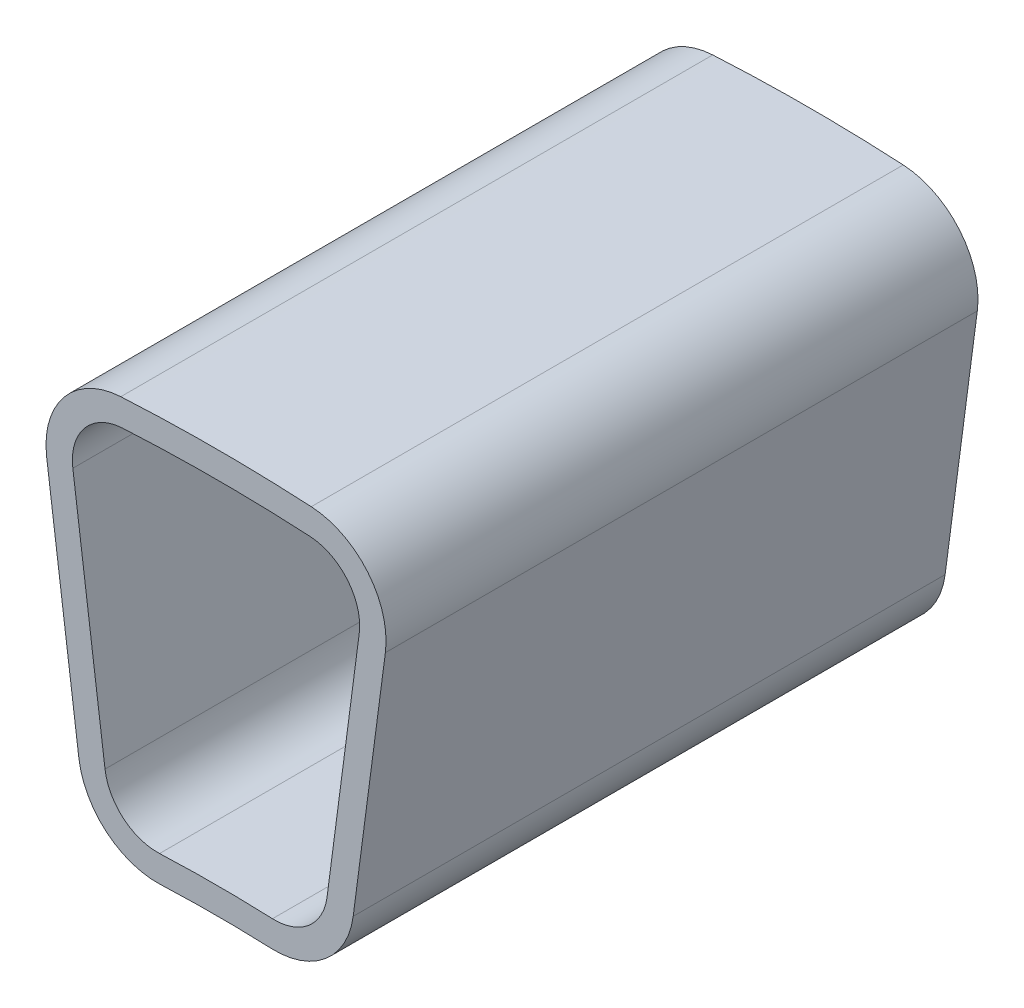
ISO-10303-21;
HEADER;
FILE_DESCRIPTION(('STEP AP214'),'2;1');
FILE_NAME('part.step','',(''),(''),'','','');
FILE_SCHEMA(('AUTOMOTIVE_DESIGN { 1 0 10303 214 1 1 1 1 }'));
ENDSEC;
DATA;
#1=APPLICATION_CONTEXT('core data for automotive mechanical design processes');
#2=APPLICATION_PROTOCOL_DEFINITION('international standard','automotive_design',2000,#1);
#3=PRODUCT_CONTEXT('',#1,'mechanical');
#4=PRODUCT('Part','Part','',(#3));
#5=PRODUCT_RELATED_PRODUCT_CATEGORY('part','',(#4));
#6=PRODUCT_DEFINITION_FORMATION('','',#4);
#7=PRODUCT_DEFINITION_CONTEXT('part definition',#1,'design');
#8=PRODUCT_DEFINITION('design','',#6,#7);
#9=PRODUCT_DEFINITION_SHAPE('','',#8);
#10=(LENGTH_UNIT() NAMED_UNIT(*) SI_UNIT(.MILLI.,.METRE.));
#11=(NAMED_UNIT(*) PLANE_ANGLE_UNIT() SI_UNIT($,.RADIAN.));
#12=(NAMED_UNIT(*) SI_UNIT($,.STERADIAN.) SOLID_ANGLE_UNIT());
#13=UNCERTAINTY_MEASURE_WITH_UNIT(LENGTH_MEASURE(1.E-05),#10,'distance_accuracy_value','');
#14=(GEOMETRIC_REPRESENTATION_CONTEXT(3) GLOBAL_UNCERTAINTY_ASSIGNED_CONTEXT((#13)) GLOBAL_UNIT_ASSIGNED_CONTEXT((#10,
#11,#12)) REPRESENTATION_CONTEXT('',''));
#15=CARTESIAN_POINT('',(0.,0.,0.));
#16=DIRECTION('',(0.,0.,1.));
#17=DIRECTION('',(1.,0.,0.));
#18=AXIS2_PLACEMENT_3D('',#15,#16,#17);
#19=CARTESIAN_POINT('',(0.,0.,63.7248048977731));
#20=DIRECTION('',(0.,0.,-1.));
#21=DIRECTION('',(-1.,0.,0.));
#22=AXIS2_PLACEMENT_3D('',#19,#20,#21);
#23=CYLINDRICAL_SURFACE('',#22,74.53735196805);
#24=CARTESIAN_POINT('',(0.,0.,33.65));
#25=DIRECTION('',(0.,0.,1.));
#26=DIRECTION('',(1.,0.,0.));
#27=AXIS2_PLACEMENT_3D('',#24,#25,#26);
#28=CIRCLE('',#27,74.53735196805);
#29=CARTESIAN_POINT('',(-3.14586682006046,74.4709363467347,33.65));
#30=VERTEX_POINT('',#29);
#31=CARTESIAN_POINT('',(3.14586682006045,74.4709363467347,33.65));
#32=VERTEX_POINT('',#31);
#33=EDGE_CURVE('E310',#30,#32,#28,.F.);
#34=ORIENTED_EDGE('',*,*,#33,.F.);
#35=DIRECTION('',(0.,0.,-1.));
#36=VECTOR('',#35,1.);
#37=CARTESIAN_POINT('',(-3.14586682006046,74.4709363467347,63.7248048977731));
#38=LINE('',#37,#36);
#39=CARTESIAN_POINT('',(-3.14586682006046,74.4709363467347,0.));
#40=VERTEX_POINT('',#39);
#41=EDGE_CURVE('E54',#30,#40,#38,.T.);
#42=ORIENTED_EDGE('',*,*,#41,.T.);
#43=CARTESIAN_POINT('',(0.,0.,0.));
#44=DIRECTION('',(0.,0.,-1.));
#45=DIRECTION('',(1.,0.,0.));
#46=AXIS2_PLACEMENT_3D('',#43,#44,#45);
#47=CIRCLE('',#46,74.53735196805);
#48=CARTESIAN_POINT('',(3.14586682006045,74.4709363467347,0.));
#49=VERTEX_POINT('',#48);
#50=EDGE_CURVE('E205',#40,#49,#47,.T.);
#51=ORIENTED_EDGE('',*,*,#50,.T.);
#52=DIRECTION('',(0.,0.,-1.));
#53=VECTOR('',#52,1.);
#54=CARTESIAN_POINT('',(3.14586682006045,74.4709363467347,63.7248048977731));
#55=LINE('',#54,#53);
#56=EDGE_CURVE('E208',#32,#49,#55,.T.);
#57=ORIENTED_EDGE('',*,*,#56,.F.);
#58=EDGE_LOOP('',(#34,#42,#51,#57));
#59=FACE_BOUND('',#58,.T.);
#60=ADVANCED_FACE('F39',(#59),#23,.F.);
#61=CARTESIAN_POINT('',(-3.33579039953427,78.9669266752341,63.7248048977731));
#62=DIRECTION('',(0.,0.,-1.));
#63=DIRECTION('',(-1.,0.,0.));
#64=AXIS2_PLACEMENT_3D('',#61,#62,#63);
#65=CYLINDRICAL_SURFACE('',#64,4.5);
#66=CARTESIAN_POINT('',(-3.33579039953427,78.9669266752341,33.65));
#67=DIRECTION('',(0.,0.,1.));
#68=DIRECTION('',(1.,0.,0.));
#69=AXIS2_PLACEMENT_3D('',#66,#67,#68);
#70=CIRCLE('',#69,4.5);
#71=CARTESIAN_POINT('',(-7.79729227571643,78.3795588102439,33.65));
#72=VERTEX_POINT('',#71);
#73=EDGE_CURVE('E246',#72,#30,#70,.T.);
#74=ORIENTED_EDGE('',*,*,#73,.F.);
#75=DIRECTION('',(0.,0.,-1.));
#76=VECTOR('',#75,1.);
#77=CARTESIAN_POINT('',(-7.79729227571643,78.3795588102439,63.7248048977731));
#78=LINE('',#77,#76);
#79=CARTESIAN_POINT('',(-7.79729227571643,78.3795588102439,0.));
#80=VERTEX_POINT('',#79);
#81=EDGE_CURVE('E211',#72,#80,#78,.T.);
#82=ORIENTED_EDGE('',*,*,#81,.T.);
#83=CARTESIAN_POINT('',(-3.33579039953427,78.9669266752341,0.));
#84=DIRECTION('',(0.,0.,1.));
#85=DIRECTION('',(1.,0.,0.));
#86=AXIS2_PLACEMENT_3D('',#83,#84,#85);
#87=CIRCLE('',#86,4.5);
#88=EDGE_CURVE('E203',#80,#40,#87,.T.);
#89=ORIENTED_EDGE('',*,*,#88,.T.);
#90=ORIENTED_EDGE('',*,*,#41,.F.);
#91=EDGE_LOOP('',(#74,#82,#89,#90));
#92=FACE_BOUND('',#91,.T.);
#93=ADVANCED_FACE('F243',(#92),#65,.T.);
#94=CARTESIAN_POINT('',(-9.62675062646801,92.2756746020247,63.7248048977731));
#95=DIRECTION('',(0.99144486137381,0.130526192220051,0.));
#96=DIRECTION('',(-0.130526192220051,0.991444861373811,0.));
#97=AXIS2_PLACEMENT_3D('',#94,#95,#96);
#98=PLANE('',#97);
#99=DIRECTION('',(0.130526192220051,-0.991444861373811,0.));
#100=VECTOR('',#99,1.);
#101=CARTESIAN_POINT('',(-9.62675062646801,92.2756746020247,33.65));
#102=LINE('',#101,#100);
#103=CARTESIAN_POINT('',(-9.62675062646801,92.2756746020247,33.65));
#104=VERTEX_POINT('',#103);
#105=EDGE_CURVE('E251',#104,#72,#102,.T.);
#106=ORIENTED_EDGE('',*,*,#105,.F.);
#107=DIRECTION('',(0.,0.,-1.));
#108=VECTOR('',#107,1.);
#109=CARTESIAN_POINT('',(-9.62675062646801,92.2756746020247,63.7248048977731));
#110=LINE('',#109,#108);
#111=CARTESIAN_POINT('',(-9.62675062646801,92.2756746020247,0.));
#112=VERTEX_POINT('',#111);
#113=EDGE_CURVE('E213',#104,#112,#110,.T.);
#114=ORIENTED_EDGE('',*,*,#113,.T.);
#115=DIRECTION('',(0.130526192220051,-0.991444861373811,0.));
#116=VECTOR('',#115,1.);
#117=CARTESIAN_POINT('',(-9.62675062646801,92.2756746020247,0.));
#118=LINE('',#117,#116);
#119=EDGE_CURVE('E200',#112,#80,#118,.T.);
#120=ORIENTED_EDGE('',*,*,#119,.T.);
#121=ORIENTED_EDGE('',*,*,#81,.F.);
#122=EDGE_LOOP('',(#106,#114,#120,#121));
#123=FACE_BOUND('',#122,.T.);
#124=ADVANCED_FACE('F249',(#123),#98,.F.);
#125=CARTESIAN_POINT('',(-5.16524875028588,92.8630424670149,63.7248048977731));
#126=DIRECTION('',(0.,0.,-1.));
#127=DIRECTION('',(-1.,0.,0.));
#128=AXIS2_PLACEMENT_3D('',#125,#126,#127);
#129=CYLINDRICAL_SURFACE('',#128,4.49999999999999);
#130=CARTESIAN_POINT('',(-5.16524875028588,92.8630424670149,33.65));
#131=DIRECTION('',(0.,0.,1.));
#132=DIRECTION('',(1.,0.,0.));
#133=AXIS2_PLACEMENT_3D('',#130,#131,#132);
#134=CIRCLE('',#133,4.49999999999999);
#135=CARTESIAN_POINT('',(-5.41516245174076,97.3560974568659,33.65));
#136=VERTEX_POINT('',#135);
#137=EDGE_CURVE('E314',#136,#104,#134,.T.);
#138=ORIENTED_EDGE('',*,*,#137,.F.);
#139=DIRECTION('',(0.,0.,-1.));
#140=VECTOR('',#139,1.);
#141=CARTESIAN_POINT('',(-5.41516245174076,97.3560974568659,63.7248048977731));
#142=LINE('',#141,#140);
#143=CARTESIAN_POINT('',(-5.41516245174076,97.3560974568659,0.));
#144=VERTEX_POINT('',#143);
#145=EDGE_CURVE('E215',#136,#144,#142,.T.);
#146=ORIENTED_EDGE('',*,*,#145,.T.);
#147=CARTESIAN_POINT('',(-5.16524875028588,92.8630424670149,0.));
#148=DIRECTION('',(0.,0.,1.));
#149=DIRECTION('',(1.,0.,0.));
#150=AXIS2_PLACEMENT_3D('',#147,#148,#149);
#151=CIRCLE('',#150,4.49999999999999);
#152=EDGE_CURVE('E197',#144,#112,#151,.T.);
#153=ORIENTED_EDGE('',*,*,#152,.T.);
#154=ORIENTED_EDGE('',*,*,#113,.F.);
#155=EDGE_LOOP('',(#138,#146,#153,#154));
#156=FACE_BOUND('',#155,.T.);
#157=ADVANCED_FACE('F254',(#156),#129,.T.);
#158=CARTESIAN_POINT('',(0.,0.,63.7248048977731));
#159=DIRECTION('',(0.,0.,-1.));
#160=DIRECTION('',(-1.,0.,0.));
#161=AXIS2_PLACEMENT_3D('',#158,#159,#160);
#162=CYLINDRICAL_SURFACE('',#161,97.5065828362861);
#163=CARTESIAN_POINT('',(0.,0.,33.65));
#164=DIRECTION('',(0.,0.,1.));
#165=DIRECTION('',(1.,0.,0.));
#166=AXIS2_PLACEMENT_3D('',#163,#164,#165);
#167=CIRCLE('',#166,97.5065828362861);
#168=CARTESIAN_POINT('',(5.41516245174078,97.3560974568659,33.65));
#169=VERTEX_POINT('',#168);
#170=EDGE_CURVE('E260',#169,#136,#167,.T.);
#171=ORIENTED_EDGE('',*,*,#170,.F.);
#172=DIRECTION('',(0.,0.,-1.));
#173=VECTOR('',#172,1.);
#174=CARTESIAN_POINT('',(5.41516245174078,97.3560974568659,63.7248048977731));
#175=LINE('',#174,#173);
#176=CARTESIAN_POINT('',(5.41516245174078,97.3560974568659,0.));
#177=VERTEX_POINT('',#176);
#178=EDGE_CURVE('E217',#169,#177,#175,.T.);
#179=ORIENTED_EDGE('',*,*,#178,.T.);
#180=CARTESIAN_POINT('',(0.,0.,0.));
#181=DIRECTION('',(0.,0.,1.));
#182=DIRECTION('',(1.,0.,0.));
#183=AXIS2_PLACEMENT_3D('',#180,#181,#182);
#184=CIRCLE('',#183,97.5065828362861);
#185=EDGE_CURVE('E194',#177,#144,#184,.T.);
#186=ORIENTED_EDGE('',*,*,#185,.T.);
#187=ORIENTED_EDGE('',*,*,#145,.F.);
#188=EDGE_LOOP('',(#171,#179,#186,#187));
#189=FACE_BOUND('',#188,.T.);
#190=ADVANCED_FACE('F257',(#189),#162,.T.);
#191=CARTESIAN_POINT('',(5.16524875028588,92.8630424670149,63.7248048977731));
#192=DIRECTION('',(0.,0.,-1.));
#193=DIRECTION('',(-1.,0.,0.));
#194=AXIS2_PLACEMENT_3D('',#191,#192,#193);
#195=CYLINDRICAL_SURFACE('',#194,4.50000000000001);
#196=CARTESIAN_POINT('',(5.16524875028588,92.8630424670149,33.65));
#197=DIRECTION('',(0.,0.,1.));
#198=DIRECTION('',(1.,0.,0.));
#199=AXIS2_PLACEMENT_3D('',#196,#197,#198);
#200=CIRCLE('',#199,4.50000000000001);
#201=CARTESIAN_POINT('',(9.62675062646804,92.2756746020247,33.65));
#202=VERTEX_POINT('',#201);
#203=EDGE_CURVE('E264',#202,#169,#200,.T.);
#204=ORIENTED_EDGE('',*,*,#203,.F.);
#205=DIRECTION('',(0.,0.,-1.));
#206=VECTOR('',#205,1.);
#207=CARTESIAN_POINT('',(9.62675062646804,92.2756746020247,63.7248048977731));
#208=LINE('',#207,#206);
#209=CARTESIAN_POINT('',(9.62675062646804,92.2756746020247,0.));
#210=VERTEX_POINT('',#209);
#211=EDGE_CURVE('E219',#202,#210,#208,.T.);
#212=ORIENTED_EDGE('',*,*,#211,.T.);
#213=CARTESIAN_POINT('',(5.16524875028588,92.8630424670149,0.));
#214=DIRECTION('',(0.,0.,1.));
#215=DIRECTION('',(1.,0.,0.));
#216=AXIS2_PLACEMENT_3D('',#213,#214,#215);
#217=CIRCLE('',#216,4.50000000000001);
#218=EDGE_CURVE('E191',#210,#177,#217,.T.);
#219=ORIENTED_EDGE('',*,*,#218,.T.);
#220=ORIENTED_EDGE('',*,*,#178,.F.);
#221=EDGE_LOOP('',(#204,#212,#219,#220));
#222=FACE_BOUND('',#221,.T.);
#223=ADVANCED_FACE('F263',(#222),#195,.T.);
#224=CARTESIAN_POINT('',(7.7972922757164,78.3795588102438,63.7248048977731));
#225=DIRECTION('',(-0.99144486137381,0.130526192220054,0.));
#226=DIRECTION('',(-0.130526192220054,-0.99144486137381,0.));
#227=AXIS2_PLACEMENT_3D('',#224,#225,#226);
#228=PLANE('',#227);
#229=DIRECTION('',(0.130526192220054,0.99144486137381,0.));
#230=VECTOR('',#229,1.);
#231=CARTESIAN_POINT('',(7.7972922757164,78.3795588102438,33.65));
#232=LINE('',#231,#230);
#233=CARTESIAN_POINT('',(7.7972922757164,78.3795588102438,33.65));
#234=VERTEX_POINT('',#233);
#235=EDGE_CURVE('E227',#234,#202,#232,.T.);
#236=ORIENTED_EDGE('',*,*,#235,.F.);
#237=DIRECTION('',(0.,0.,-1.));
#238=VECTOR('',#237,1.);
#239=CARTESIAN_POINT('',(7.7972922757164,78.3795588102438,63.7248048977731));
#240=LINE('',#239,#238);
#241=CARTESIAN_POINT('',(7.7972922757164,78.3795588102438,0.));
#242=VERTEX_POINT('',#241);
#243=EDGE_CURVE('E47',#234,#242,#240,.T.);
#244=ORIENTED_EDGE('',*,*,#243,.T.);
#245=DIRECTION('',(0.130526192220054,0.99144486137381,0.));
#246=VECTOR('',#245,1.);
#247=CARTESIAN_POINT('',(7.7972922757164,78.3795588102438,0.));
#248=LINE('',#247,#246);
#249=EDGE_CURVE('E188',#242,#210,#248,.T.);
#250=ORIENTED_EDGE('',*,*,#249,.T.);
#251=ORIENTED_EDGE('',*,*,#211,.F.);
#252=EDGE_LOOP('',(#236,#244,#250,#251));
#253=FACE_BOUND('',#252,.T.);
#254=ADVANCED_FACE('F223',(#253),#228,.F.);
#255=CARTESIAN_POINT('',(3.33579039953427,78.966926675234,63.7248048977731));
#256=DIRECTION('',(0.,0.,-1.));
#257=DIRECTION('',(-1.,0.,0.));
#258=AXIS2_PLACEMENT_3D('',#255,#256,#257);
#259=CYLINDRICAL_SURFACE('',#258,4.49999999999999);
#260=CARTESIAN_POINT('',(3.33579039953427,78.966926675234,33.65));
#261=DIRECTION('',(0.,0.,1.));
#262=DIRECTION('',(1.,0.,0.));
#263=AXIS2_PLACEMENT_3D('',#260,#261,#262);
#264=CIRCLE('',#263,4.49999999999999);
#265=EDGE_CURVE('E237',#32,#234,#264,.T.);
#266=ORIENTED_EDGE('',*,*,#265,.F.);
#267=ORIENTED_EDGE('',*,*,#56,.T.);
#268=CARTESIAN_POINT('',(3.33579039953427,78.966926675234,0.));
#269=DIRECTION('',(0.,0.,1.));
#270=DIRECTION('',(1.,0.,0.));
#271=AXIS2_PLACEMENT_3D('',#268,#269,#270);
#272=CIRCLE('',#271,4.49999999999999);
#273=EDGE_CURVE('E185',#49,#242,#272,.T.);
#274=ORIENTED_EDGE('',*,*,#273,.T.);
#275=ORIENTED_EDGE('',*,*,#243,.F.);
#276=EDGE_LOOP('',(#266,#267,#274,#275));
#277=FACE_BOUND('',#276,.T.);
#278=ADVANCED_FACE('F41',(#277),#259,.T.);
#279=CARTESIAN_POINT('',(3.33579039953427,78.966926675234,0.));
#280=DIRECTION('',(0.,0.,1.));
#281=DIRECTION('',(1.,0.,0.));
#282=AXIS2_PLACEMENT_3D('',#279,#280,#281);
#283=PLANE('',#282);
#284=ORIENTED_EDGE('',*,*,#273,.F.);
#285=ORIENTED_EDGE('',*,*,#50,.F.);
#286=ORIENTED_EDGE('',*,*,#88,.F.);
#287=ORIENTED_EDGE('',*,*,#119,.F.);
#288=ORIENTED_EDGE('',*,*,#152,.F.);
#289=ORIENTED_EDGE('',*,*,#185,.F.);
#290=ORIENTED_EDGE('',*,*,#218,.F.);
#291=ORIENTED_EDGE('',*,*,#249,.F.);
#292=EDGE_LOOP('',(#284,#285,#286,#287,#288,#289,#290,#291));
#293=FACE_BOUND('',#292,.T.);
#294=CARTESIAN_POINT('',(5.16524875028588,92.8630424670149,0.));
#295=DIRECTION('',(0.,0.,1.));
#296=DIRECTION('',(1.,0.,0.));
#297=AXIS2_PLACEMENT_3D('',#294,#295,#296);
#298=CIRCLE('',#297,3.00000000000001);
#299=CARTESIAN_POINT('',(8.13958333440732,92.4714638903548,0.));
#300=VERTEX_POINT('',#299);
#301=CARTESIAN_POINT('',(5.33185788458914,95.8584124602489,0.));
#302=VERTEX_POINT('',#301);
#303=EDGE_CURVE('E266',#300,#302,#298,.T.);
#304=ORIENTED_EDGE('',*,*,#303,.T.);
#305=CARTESIAN_POINT('',(0.,0.,0.));
#306=DIRECTION('',(0.,0.,1.));
#307=DIRECTION('',(1.,0.,0.));
#308=AXIS2_PLACEMENT_3D('',#305,#306,#307);
#309=CIRCLE('',#308,96.0065828362861);
#310=CARTESIAN_POINT('',(-5.33185788458913,95.8584124602489,0.));
#311=VERTEX_POINT('',#310);
#312=EDGE_CURVE('E273',#302,#311,#309,.T.);
#313=ORIENTED_EDGE('',*,*,#312,.T.);
#314=CARTESIAN_POINT('',(-5.16524875028588,92.8630424670149,0.));
#315=DIRECTION('',(0.,0.,1.));
#316=DIRECTION('',(1.,0.,0.));
#317=AXIS2_PLACEMENT_3D('',#314,#315,#316);
#318=CIRCLE('',#317,2.99999999999998);
#319=CARTESIAN_POINT('',(-8.1395833344073,92.4714638903548,0.));
#320=VERTEX_POINT('',#319);
#321=EDGE_CURVE('E276',#311,#320,#318,.T.);
#322=ORIENTED_EDGE('',*,*,#321,.T.);
#323=DIRECTION('',(0.130526192220051,-0.991444861373811,0.));
#324=VECTOR('',#323,1.);
#325=CARTESIAN_POINT('',(-8.1395833344073,92.4714638903548,0.));
#326=LINE('',#325,#324);
#327=CARTESIAN_POINT('',(-6.31012498365571,78.5753480985739,0.));
#328=VERTEX_POINT('',#327);
#329=EDGE_CURVE('E279',#320,#328,#326,.T.);
#330=ORIENTED_EDGE('',*,*,#329,.T.);
#331=CARTESIAN_POINT('',(-3.33579039953427,78.9669266752341,0.));
#332=DIRECTION('',(0.,0.,1.));
#333=DIRECTION('',(1.,0.,0.));
#334=AXIS2_PLACEMENT_3D('',#331,#332,#333);
#335=CIRCLE('',#334,3.00000000000001);
#336=CARTESIAN_POINT('',(-3.20917467988506,75.9695997895678,0.));
#337=VERTEX_POINT('',#336);
#338=EDGE_CURVE('E282',#328,#337,#335,.T.);
#339=ORIENTED_EDGE('',*,*,#338,.T.);
#340=CARTESIAN_POINT('',(0.,0.,0.));
#341=DIRECTION('',(0.,0.,-1.));
#342=DIRECTION('',(1.,0.,0.));
#343=AXIS2_PLACEMENT_3D('',#340,#341,#342);
#344=CIRCLE('',#343,76.03735196805);
#345=CARTESIAN_POINT('',(3.20917467988505,75.9695997895678,0.));
#346=VERTEX_POINT('',#345);
#347=EDGE_CURVE('E285',#337,#346,#344,.T.);
#348=ORIENTED_EDGE('',*,*,#347,.T.);
#349=CARTESIAN_POINT('',(3.33579039953427,78.966926675234,0.));
#350=DIRECTION('',(0.,0.,1.));
#351=DIRECTION('',(1.,0.,0.));
#352=AXIS2_PLACEMENT_3D('',#349,#350,#351);
#353=CIRCLE('',#352,2.99999999999998);
#354=CARTESIAN_POINT('',(6.31012498365569,78.5753480985739,0.));
#355=VERTEX_POINT('',#354);
#356=EDGE_CURVE('E288',#346,#355,#353,.T.);
#357=ORIENTED_EDGE('',*,*,#356,.T.);
#358=DIRECTION('',(0.130526192220054,0.99144486137381,0.));
#359=VECTOR('',#358,1.);
#360=CARTESIAN_POINT('',(6.31012498365569,78.5753480985739,0.));
#361=LINE('',#360,#359);
#362=EDGE_CURVE('E167',#355,#300,#361,.T.);
#363=ORIENTED_EDGE('',*,*,#362,.T.);
#364=EDGE_LOOP('',(#304,#313,#322,#330,#339,#348,#357,#363));
#365=FACE_BOUND('',#364,.T.);
#366=ADVANCED_FACE('F233',(#293,#365),#283,.F.);
#367=CARTESIAN_POINT('',(6.31012498365569,78.5753480985739,63.7248048977731));
#368=DIRECTION('',(-0.99144486137381,0.130526192220054,0.));
#369=DIRECTION('',(-0.130526192220054,-0.99144486137381,0.));
#370=AXIS2_PLACEMENT_3D('',#367,#368,#369);
#371=PLANE('',#370);
#372=DIRECTION('',(0.,0.,-1.));
#373=VECTOR('',#372,1.);
#374=CARTESIAN_POINT('',(6.31012498365569,78.5753480985739,63.7248048977731));
#375=LINE('',#374,#373);
#376=CARTESIAN_POINT('',(6.31012498365569,78.5753480985739,33.65));
#377=VERTEX_POINT('',#376);
#378=EDGE_CURVE('E159',#377,#355,#375,.T.);
#379=ORIENTED_EDGE('',*,*,#378,.F.);
#380=DIRECTION('',(0.130526192220054,0.99144486137381,0.));
#381=VECTOR('',#380,1.);
#382=CARTESIAN_POINT('',(6.31012498365569,78.5753480985739,33.65));
#383=LINE('',#382,#381);
#384=CARTESIAN_POINT('',(8.13958333440732,92.4714638903548,33.65));
#385=VERTEX_POINT('',#384);
#386=EDGE_CURVE('E11',#377,#385,#383,.T.);
#387=ORIENTED_EDGE('',*,*,#386,.T.);
#388=DIRECTION('',(0.,0.,-1.));
#389=VECTOR('',#388,1.);
#390=CARTESIAN_POINT('',(8.13958333440732,92.4714638903548,63.7248048977731));
#391=LINE('',#390,#389);
#392=EDGE_CURVE('E169',#385,#300,#391,.T.);
#393=ORIENTED_EDGE('',*,*,#392,.T.);
#394=ORIENTED_EDGE('',*,*,#362,.F.);
#395=EDGE_LOOP('',(#379,#387,#393,#394));
#396=FACE_BOUND('',#395,.T.);
#397=ADVANCED_FACE('F165',(#396),#371,.T.);
#398=CARTESIAN_POINT('',(3.33579039953427,78.966926675234,63.7248048977731));
#399=DIRECTION('',(0.,0.,-1.));
#400=DIRECTION('',(-1.,0.,0.));
#401=AXIS2_PLACEMENT_3D('',#398,#399,#400);
#402=CYLINDRICAL_SURFACE('',#401,2.99999999999998);
#403=DIRECTION('',(0.,0.,-1.));
#404=VECTOR('',#403,1.);
#405=CARTESIAN_POINT('',(3.20917467988505,75.9695997895678,63.7248048977731));
#406=LINE('',#405,#404);
#407=CARTESIAN_POINT('',(3.20917467988505,75.9695997895678,33.65));
#408=VERTEX_POINT('',#407);
#409=EDGE_CURVE('E161',#408,#346,#406,.T.);
#410=ORIENTED_EDGE('',*,*,#409,.F.);
#411=CARTESIAN_POINT('',(3.33579039953427,78.966926675234,33.65));
#412=DIRECTION('',(0.,0.,1.));
#413=DIRECTION('',(1.,0.,0.));
#414=AXIS2_PLACEMENT_3D('',#411,#412,#413);
#415=CIRCLE('',#414,2.99999999999998);
#416=EDGE_CURVE('E152',#408,#377,#415,.T.);
#417=ORIENTED_EDGE('',*,*,#416,.T.);
#418=ORIENTED_EDGE('',*,*,#378,.T.);
#419=ORIENTED_EDGE('',*,*,#356,.F.);
#420=EDGE_LOOP('',(#410,#417,#418,#419));
#421=FACE_BOUND('',#420,.T.);
#422=ADVANCED_FACE('F157',(#421),#402,.F.);
#423=CARTESIAN_POINT('',(0.,0.,63.7248048977731));
#424=DIRECTION('',(0.,0.,-1.));
#425=DIRECTION('',(-1.,0.,0.));
#426=AXIS2_PLACEMENT_3D('',#423,#424,#425);
#427=CYLINDRICAL_SURFACE('',#426,76.03735196805);
#428=DIRECTION('',(0.,0.,-1.));
#429=VECTOR('',#428,1.);
#430=CARTESIAN_POINT('',(-3.20917467988506,75.9695997895678,63.7248048977731));
#431=LINE('',#430,#429);
#432=CARTESIAN_POINT('',(-3.20917467988506,75.9695997895678,33.65));
#433=VERTEX_POINT('',#432);
#434=EDGE_CURVE('E171',#433,#337,#431,.T.);
#435=ORIENTED_EDGE('',*,*,#434,.F.);
#436=CARTESIAN_POINT('',(0.,0.,33.65));
#437=DIRECTION('',(0.,0.,1.));
#438=DIRECTION('',(1.,0.,0.));
#439=AXIS2_PLACEMENT_3D('',#436,#437,#438);
#440=CIRCLE('',#439,76.03735196805);
#441=EDGE_CURVE('E163',#433,#408,#440,.F.);
#442=ORIENTED_EDGE('',*,*,#441,.T.);
#443=ORIENTED_EDGE('',*,*,#409,.T.);
#444=ORIENTED_EDGE('',*,*,#347,.F.);
#445=EDGE_LOOP('',(#435,#442,#443,#444));
#446=FACE_BOUND('',#445,.T.);
#447=ADVANCED_FACE('F294',(#446),#427,.T.);
#448=CARTESIAN_POINT('',(-3.33579039953427,78.9669266752341,63.7248048977731));
#449=DIRECTION('',(0.,0.,-1.));
#450=DIRECTION('',(-1.,0.,0.));
#451=AXIS2_PLACEMENT_3D('',#448,#449,#450);
#452=CYLINDRICAL_SURFACE('',#451,3.00000000000001);
#453=DIRECTION('',(0.,0.,-1.));
#454=VECTOR('',#453,1.);
#455=CARTESIAN_POINT('',(-6.31012498365571,78.5753480985739,63.7248048977731));
#456=LINE('',#455,#454);
#457=CARTESIAN_POINT('',(-6.31012498365571,78.5753480985739,33.65));
#458=VERTEX_POINT('',#457);
#459=EDGE_CURVE('E177',#458,#328,#456,.T.);
#460=ORIENTED_EDGE('',*,*,#459,.F.);
#461=CARTESIAN_POINT('',(-3.33579039953427,78.9669266752341,33.65));
#462=DIRECTION('',(0.,0.,1.));
#463=DIRECTION('',(1.,0.,0.));
#464=AXIS2_PLACEMENT_3D('',#461,#462,#463);
#465=CIRCLE('',#464,3.00000000000001);
#466=EDGE_CURVE('E296',#458,#433,#465,.T.);
#467=ORIENTED_EDGE('',*,*,#466,.T.);
#468=ORIENTED_EDGE('',*,*,#434,.T.);
#469=ORIENTED_EDGE('',*,*,#338,.F.);
#470=EDGE_LOOP('',(#460,#467,#468,#469));
#471=FACE_BOUND('',#470,.T.);
#472=ADVANCED_FACE('F331',(#471),#452,.F.);
#473=CARTESIAN_POINT('',(-8.1395833344073,92.4714638903548,63.7248048977731));
#474=DIRECTION('',(0.99144486137381,0.130526192220051,0.));
#475=DIRECTION('',(-0.130526192220051,0.991444861373811,0.));
#476=AXIS2_PLACEMENT_3D('',#473,#474,#475);
#477=PLANE('',#476);
#478=DIRECTION('',(0.,0.,-1.));
#479=VECTOR('',#478,1.);
#480=CARTESIAN_POINT('',(-8.1395833344073,92.4714638903548,63.7248048977731));
#481=LINE('',#480,#479);
#482=CARTESIAN_POINT('',(-8.1395833344073,92.4714638903548,33.65));
#483=VERTEX_POINT('',#482);
#484=EDGE_CURVE('E179',#483,#320,#481,.T.);
#485=ORIENTED_EDGE('',*,*,#484,.F.);
#486=DIRECTION('',(0.130526192220051,-0.991444861373811,0.));
#487=VECTOR('',#486,1.);
#488=CARTESIAN_POINT('',(-8.1395833344073,92.4714638903548,33.65));
#489=LINE('',#488,#487);
#490=EDGE_CURVE('E298',#483,#458,#489,.T.);
#491=ORIENTED_EDGE('',*,*,#490,.T.);
#492=ORIENTED_EDGE('',*,*,#459,.T.);
#493=ORIENTED_EDGE('',*,*,#329,.F.);
#494=EDGE_LOOP('',(#485,#491,#492,#493));
#495=FACE_BOUND('',#494,.T.);
#496=ADVANCED_FACE('F328',(#495),#477,.T.);
#497=CARTESIAN_POINT('',(-5.16524875028588,92.8630424670149,63.7248048977731));
#498=DIRECTION('',(0.,0.,-1.));
#499=DIRECTION('',(-1.,0.,0.));
#500=AXIS2_PLACEMENT_3D('',#497,#498,#499);
#501=CYLINDRICAL_SURFACE('',#500,2.99999999999998);
#502=DIRECTION('',(0.,0.,-1.));
#503=VECTOR('',#502,1.);
#504=CARTESIAN_POINT('',(-5.33185788458913,95.8584124602489,63.7248048977731));
#505=LINE('',#504,#503);
#506=CARTESIAN_POINT('',(-5.33185788458913,95.8584124602489,33.65));
#507=VERTEX_POINT('',#506);
#508=EDGE_CURVE('E181',#507,#311,#505,.T.);
#509=ORIENTED_EDGE('',*,*,#508,.F.);
#510=CARTESIAN_POINT('',(-5.16524875028588,92.8630424670149,33.65));
#511=DIRECTION('',(0.,0.,1.));
#512=DIRECTION('',(1.,0.,0.));
#513=AXIS2_PLACEMENT_3D('',#510,#511,#512);
#514=CIRCLE('',#513,2.99999999999998);
#515=EDGE_CURVE('E303',#507,#483,#514,.T.);
#516=ORIENTED_EDGE('',*,*,#515,.T.);
#517=ORIENTED_EDGE('',*,*,#484,.T.);
#518=ORIENTED_EDGE('',*,*,#321,.F.);
#519=EDGE_LOOP('',(#509,#516,#517,#518));
#520=FACE_BOUND('',#519,.T.);
#521=ADVANCED_FACE('F325',(#520),#501,.F.);
#522=CARTESIAN_POINT('',(0.,0.,63.7248048977731));
#523=DIRECTION('',(0.,0.,-1.));
#524=DIRECTION('',(-1.,0.,0.));
#525=AXIS2_PLACEMENT_3D('',#522,#523,#524);
#526=CYLINDRICAL_SURFACE('',#525,96.0065828362861);
#527=DIRECTION('',(0.,0.,-1.));
#528=VECTOR('',#527,1.);
#529=CARTESIAN_POINT('',(5.33185788458914,95.8584124602489,63.7248048977731));
#530=LINE('',#529,#528);
#531=CARTESIAN_POINT('',(5.33185788458914,95.8584124602489,33.65));
#532=VERTEX_POINT('',#531);
#533=EDGE_CURVE('E183',#532,#302,#530,.T.);
#534=ORIENTED_EDGE('',*,*,#533,.F.);
#535=CARTESIAN_POINT('',(0.,0.,33.65));
#536=DIRECTION('',(0.,0.,1.));
#537=DIRECTION('',(1.,0.,0.));
#538=AXIS2_PLACEMENT_3D('',#535,#536,#537);
#539=CIRCLE('',#538,96.0065828362861);
#540=EDGE_CURVE('E306',#532,#507,#539,.T.);
#541=ORIENTED_EDGE('',*,*,#540,.T.);
#542=ORIENTED_EDGE('',*,*,#508,.T.);
#543=ORIENTED_EDGE('',*,*,#312,.F.);
#544=EDGE_LOOP('',(#534,#541,#542,#543));
#545=FACE_BOUND('',#544,.T.);
#546=ADVANCED_FACE('F320',(#545),#526,.F.);
#547=CARTESIAN_POINT('',(5.16524875028588,92.8630424670149,63.7248048977731));
#548=DIRECTION('',(0.,0.,-1.));
#549=DIRECTION('',(-1.,0.,0.));
#550=AXIS2_PLACEMENT_3D('',#547,#548,#549);
#551=CYLINDRICAL_SURFACE('',#550,3.00000000000001);
#552=ORIENTED_EDGE('',*,*,#392,.F.);
#553=CARTESIAN_POINT('',(5.16524875028588,92.8630424670149,33.65));
#554=DIRECTION('',(0.,0.,1.));
#555=DIRECTION('',(1.,0.,0.));
#556=AXIS2_PLACEMENT_3D('',#553,#554,#555);
#557=CIRCLE('',#556,3.00000000000001);
#558=EDGE_CURVE('E62',#385,#532,#557,.T.);
#559=ORIENTED_EDGE('',*,*,#558,.T.);
#560=ORIENTED_EDGE('',*,*,#533,.T.);
#561=ORIENTED_EDGE('',*,*,#303,.F.);
#562=EDGE_LOOP('',(#552,#559,#560,#561));
#563=FACE_BOUND('',#562,.T.);
#564=ADVANCED_FACE('F316',(#563),#551,.F.);
#565=CARTESIAN_POINT('',(5.16524875028588,92.8630424670149,33.65));
#566=DIRECTION('',(0.,0.,1.));
#567=DIRECTION('',(1.,0.,0.));
#568=AXIS2_PLACEMENT_3D('',#565,#566,#567);
#569=PLANE('',#568);
#570=ORIENTED_EDGE('',*,*,#558,.F.);
#571=ORIENTED_EDGE('',*,*,#386,.F.);
#572=ORIENTED_EDGE('',*,*,#416,.F.);
#573=ORIENTED_EDGE('',*,*,#441,.F.);
#574=ORIENTED_EDGE('',*,*,#466,.F.);
#575=ORIENTED_EDGE('',*,*,#490,.F.);
#576=ORIENTED_EDGE('',*,*,#515,.F.);
#577=ORIENTED_EDGE('',*,*,#540,.F.);
#578=EDGE_LOOP('',(#570,#571,#572,#573,#574,#575,#576,#577));
#579=FACE_BOUND('',#578,.T.);
#580=ORIENTED_EDGE('',*,*,#33,.T.);
#581=ORIENTED_EDGE('',*,*,#265,.T.);
#582=ORIENTED_EDGE('',*,*,#235,.T.);
#583=ORIENTED_EDGE('',*,*,#203,.T.);
#584=ORIENTED_EDGE('',*,*,#170,.T.);
#585=ORIENTED_EDGE('',*,*,#137,.T.);
#586=ORIENTED_EDGE('',*,*,#105,.T.);
#587=ORIENTED_EDGE('',*,*,#73,.T.);
#588=EDGE_LOOP('',(#580,#581,#582,#583,#584,#585,#586,#587));
#589=FACE_BOUND('',#588,.T.);
#590=ADVANCED_FACE('F150',(#579,#589),#569,.T.);
#591=CLOSED_SHELL('',(#60,#93,#124,#157,#190,#223,#254,#278,#366,#397,#422,#447,#472,#496,#521,
#546,#564,#590));
#592=MANIFOLD_SOLID_BREP('B2',#591);
#593=ADVANCED_BREP_SHAPE_REPRESENTATION('',(#18,#592),#14);
#594=SHAPE_DEFINITION_REPRESENTATION(#9,#593);
ENDSEC;
END-ISO-10303-21;
